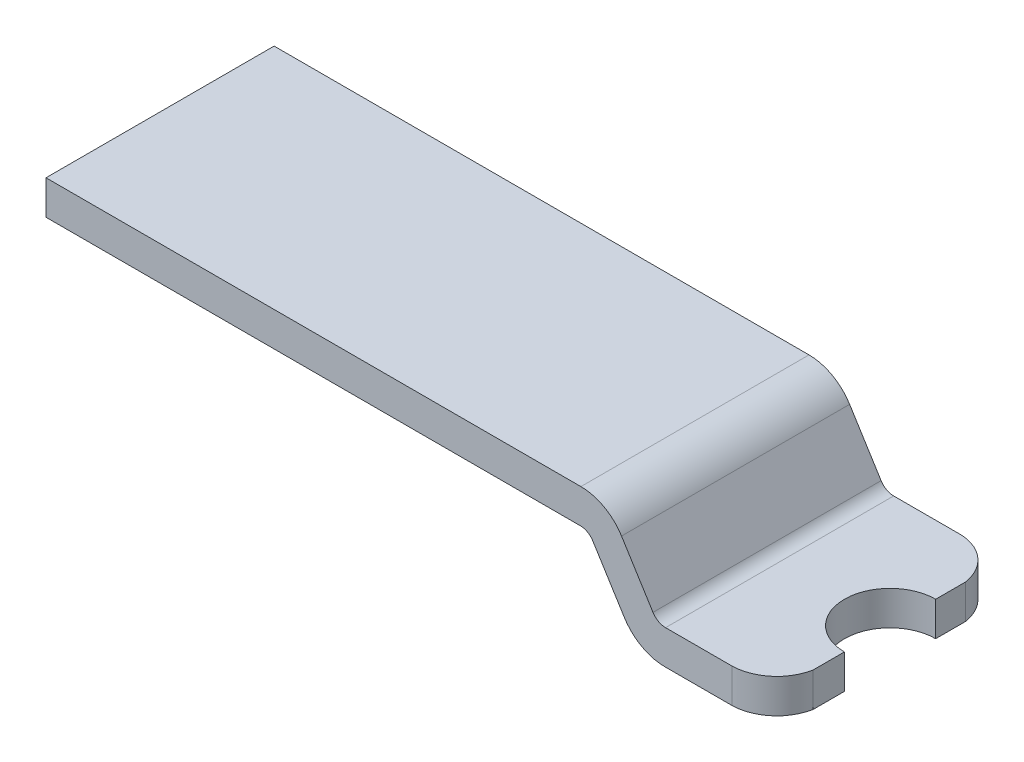
ISO-10303-21;
HEADER;
FILE_DESCRIPTION(('STEP AP214'),'2;1');
FILE_NAME('part.step','',(''),(''),'','','');
FILE_SCHEMA(('AUTOMOTIVE_DESIGN { 1 0 10303 214 1 1 1 1 }'));
ENDSEC;
DATA;
#1=APPLICATION_CONTEXT('core data for automotive mechanical design processes');
#2=APPLICATION_PROTOCOL_DEFINITION('international standard','automotive_design',2000,#1);
#3=PRODUCT_CONTEXT('',#1,'mechanical');
#4=PRODUCT('Part','Part','',(#3));
#5=PRODUCT_RELATED_PRODUCT_CATEGORY('part','',(#4));
#6=PRODUCT_DEFINITION_FORMATION('','',#4);
#7=PRODUCT_DEFINITION_CONTEXT('part definition',#1,'design');
#8=PRODUCT_DEFINITION('design','',#6,#7);
#9=PRODUCT_DEFINITION_SHAPE('','',#8);
#10=(LENGTH_UNIT() NAMED_UNIT(*) SI_UNIT(.MILLI.,.METRE.));
#11=(NAMED_UNIT(*) PLANE_ANGLE_UNIT() SI_UNIT($,.RADIAN.));
#12=(NAMED_UNIT(*) SI_UNIT($,.STERADIAN.) SOLID_ANGLE_UNIT());
#13=UNCERTAINTY_MEASURE_WITH_UNIT(LENGTH_MEASURE(1.E-05),#10,'distance_accuracy_value','');
#14=(GEOMETRIC_REPRESENTATION_CONTEXT(3) GLOBAL_UNCERTAINTY_ASSIGNED_CONTEXT((#13)) GLOBAL_UNIT_ASSIGNED_CONTEXT((#10,
#11,#12)) REPRESENTATION_CONTEXT('',''));
#15=CARTESIAN_POINT('',(0.,0.,0.));
#16=DIRECTION('',(0.,0.,1.));
#17=DIRECTION('',(1.,0.,0.));
#18=AXIS2_PLACEMENT_3D('',#15,#16,#17);
#19=CARTESIAN_POINT('',(2.3,0.,-8.));
#20=DIRECTION('',(0.,0.,1.));
#21=DIRECTION('',(1.,0.,0.));
#22=AXIS2_PLACEMENT_3D('',#19,#20,#21);
#23=PLANE('',#22);
#24=DIRECTION('',(-1.,0.,0.));
#25=VECTOR('',#24,1.);
#26=CARTESIAN_POINT('',(4.1,-0.1,-8.));
#27=LINE('',#26,#25);
#28=CARTESIAN_POINT('',(3.71335362730981,-0.1,-8.));
#29=VERTEX_POINT('',#28);
#30=CARTESIAN_POINT('',(3.12631708617434,-0.1,-8.));
#31=VERTEX_POINT('',#30);
#32=EDGE_CURVE('E40',#29,#31,#27,.T.);
#33=ORIENTED_EDGE('',*,*,#32,.F.);
#34=DIRECTION('',(0.,1.,0.));
#35=VECTOR('',#34,1.);
#36=CARTESIAN_POINT('',(3.7133536273113,-0.8,-8.));
#37=LINE('',#36,#35);
#38=CARTESIAN_POINT('',(3.7133536273113,0.2,-8.));
#39=VERTEX_POINT('',#38);
#40=EDGE_CURVE('E11',#29,#39,#37,.T.);
#41=ORIENTED_EDGE('',*,*,#40,.T.);
#42=DIRECTION('',(1.,0.,0.));
#43=VECTOR('',#42,1.);
#44=CARTESIAN_POINT('',(3.13186017668886,0.2,-8.));
#45=LINE('',#44,#43);
#46=CARTESIAN_POINT('',(3.13186017668886,0.2,-8.));
#47=VERTEX_POINT('',#46);
#48=EDGE_CURVE('E54',#47,#39,#45,.T.);
#49=ORIENTED_EDGE('',*,*,#48,.F.);
#50=CARTESIAN_POINT('',(3.13186017668886,0.33,-8.));
#51=DIRECTION('',(0.,0.,1.));
#52=DIRECTION('',(1.,0.,0.));
#53=AXIS2_PLACEMENT_3D('',#50,#51,#52);
#54=CIRCLE('',#53,0.13);
#55=CARTESIAN_POINT('',(3.02161392418853,0.261110495649684,-8.));
#56=VERTEX_POINT('',#55);
#57=EDGE_CURVE('E267',#56,#47,#54,.T.);
#58=ORIENTED_EDGE('',*,*,#57,.F.);
#59=DIRECTION('',(0.529919264233202,-0.848048096156428,0.));
#60=VECTOR('',#59,1.);
#61=CARTESIAN_POINT('',(2.74576185243899,0.702566090977968,-8.));
#62=LINE('',#61,#60);
#63=CARTESIAN_POINT('',(2.74576185243899,0.702566090977968,-8.));
#64=VERTEX_POINT('',#63);
#65=EDGE_CURVE('E229',#64,#56,#62,.T.);
#66=ORIENTED_EDGE('',*,*,#65,.F.);
#67=CARTESIAN_POINT('',(2.3895816520533,0.480000000000023,-8.));
#68=DIRECTION('',(0.,0.,-1.));
#69=DIRECTION('',(1.,0.,0.));
#70=AXIS2_PLACEMENT_3D('',#67,#68,#69);
#71=CIRCLE('',#70,0.42);
#72=CARTESIAN_POINT('',(2.3895816520533,0.900000000000023,-8.));
#73=VERTEX_POINT('',#72);
#74=EDGE_CURVE('E228',#73,#64,#71,.T.);
#75=ORIENTED_EDGE('',*,*,#74,.F.);
#76=DIRECTION('',(1.,0.,0.));
#77=VECTOR('',#76,1.);
#78=CARTESIAN_POINT('',(-2.3,0.900000000000023,-8.));
#79=LINE('',#78,#77);
#80=CARTESIAN_POINT('',(-2.3,0.900000000000023,-8.));
#81=VERTEX_POINT('',#80);
#82=EDGE_CURVE('E188',#81,#73,#79,.T.);
#83=ORIENTED_EDGE('',*,*,#82,.F.);
#84=DIRECTION('',(0.,1.,0.));
#85=VECTOR('',#84,1.);
#86=CARTESIAN_POINT('',(-2.3,0.900000000000023,-8.));
#87=LINE('',#86,#85);
#88=CARTESIAN_POINT('',(-2.3,0.600000000000024,-8.));
#89=VERTEX_POINT('',#88);
#90=EDGE_CURVE('E183',#89,#81,#87,.T.);
#91=ORIENTED_EDGE('',*,*,#90,.F.);
#92=DIRECTION('',(-1.,0.,0.));
#93=VECTOR('',#92,1.);
#94=CARTESIAN_POINT('',(-2.3,0.600000000000024,-8.));
#95=LINE('',#94,#93);
#96=CARTESIAN_POINT('',(2.38403856153877,0.600000000000023,-8.));
#97=VERTEX_POINT('',#96);
#98=EDGE_CURVE('E185',#97,#89,#95,.T.);
#99=ORIENTED_EDGE('',*,*,#98,.F.);
#100=CARTESIAN_POINT('',(2.38403856153877,0.470000000000023,-8.));
#101=DIRECTION('',(0.,0.,1.));
#102=DIRECTION('',(1.,0.,0.));
#103=AXIS2_PLACEMENT_3D('',#100,#101,#102);
#104=CIRCLE('',#103,0.13);
#105=CARTESIAN_POINT('',(2.4942848140391,0.538889504350339,-8.));
#106=VERTEX_POINT('',#105);
#107=EDGE_CURVE('E317',#106,#97,#104,.T.);
#108=ORIENTED_EDGE('',*,*,#107,.F.);
#109=DIRECTION('',(-0.529919264233202,0.848048096156428,0.));
#110=VECTOR('',#109,1.);
#111=CARTESIAN_POINT('',(2.77013688578863,0.0974339090220547,-8.));
#112=LINE('',#111,#110);
#113=CARTESIAN_POINT('',(2.77013688578863,0.0974339090220546,-8.));
#114=VERTEX_POINT('',#113);
#115=EDGE_CURVE('E257',#114,#106,#112,.T.);
#116=ORIENTED_EDGE('',*,*,#115,.F.);
#117=CARTESIAN_POINT('',(3.12631708617434,0.32,-8.));
#118=DIRECTION('',(0.,0.,-1.));
#119=DIRECTION('',(1.,0.,0.));
#120=AXIS2_PLACEMENT_3D('',#117,#118,#119);
#121=CIRCLE('',#120,0.42);
#122=EDGE_CURVE('E268',#31,#114,#121,.T.);
#123=ORIENTED_EDGE('',*,*,#122,.F.);
#124=EDGE_LOOP('',(#33,#41,#49,#58,#66,#75,#83,#91,#99,#108,#116,#123));
#125=FACE_BOUND('',#124,.T.);
#126=ADVANCED_FACE('F17',(#125),#23,.T.);
#127=CARTESIAN_POINT('',(2.38403856153877,0.470000000000023,-10.));
#128=DIRECTION('',(0.,0.,-1.));
#129=DIRECTION('',(0.,-1.,0.));
#130=AXIS2_PLACEMENT_3D('',#127,#128,#129);
#131=PLANE('',#130);
#132=DIRECTION('',(1.,0.,0.));
#133=VECTOR('',#132,1.);
#134=CARTESIAN_POINT('',(3.13186017668886,0.2,-10.));
#135=LINE('',#134,#133);
#136=CARTESIAN_POINT('',(3.13186017668886,0.2,-10.));
#137=VERTEX_POINT('',#136);
#138=CARTESIAN_POINT('',(3.72808084210081,0.2,-10.));
#139=VERTEX_POINT('',#138);
#140=EDGE_CURVE('E27',#137,#139,#135,.T.);
#141=ORIENTED_EDGE('',*,*,#140,.T.);
#142=DIRECTION('',(0.,1.,0.));
#143=VECTOR('',#142,1.);
#144=CARTESIAN_POINT('',(3.72808084210081,-0.8,-10.));
#145=LINE('',#144,#143);
#146=CARTESIAN_POINT('',(3.72808084210081,-0.1,-10.));
#147=VERTEX_POINT('',#146);
#148=EDGE_CURVE('E216',#147,#139,#145,.T.);
#149=ORIENTED_EDGE('',*,*,#148,.F.);
#150=DIRECTION('',(-1.,0.,0.));
#151=VECTOR('',#150,1.);
#152=CARTESIAN_POINT('',(4.1,-0.1,-10.));
#153=LINE('',#152,#151);
#154=CARTESIAN_POINT('',(3.12631708617434,-0.1,-10.));
#155=VERTEX_POINT('',#154);
#156=EDGE_CURVE('E331',#147,#155,#153,.T.);
#157=ORIENTED_EDGE('',*,*,#156,.T.);
#158=CARTESIAN_POINT('',(3.12631708617434,0.32,-10.));
#159=DIRECTION('',(0.,0.,-1.));
#160=DIRECTION('',(-1.,0.,0.));
#161=AXIS2_PLACEMENT_3D('',#158,#159,#160);
#162=CIRCLE('',#161,0.42);
#163=CARTESIAN_POINT('',(2.77013688578863,0.0974339090220547,-10.));
#164=VERTEX_POINT('',#163);
#165=EDGE_CURVE('E273',#155,#164,#162,.T.);
#166=ORIENTED_EDGE('',*,*,#165,.T.);
#167=DIRECTION('',(-0.529919264233202,0.848048096156428,0.));
#168=VECTOR('',#167,1.);
#169=CARTESIAN_POINT('',(2.77013688578863,0.0974339090220547,-10.));
#170=LINE('',#169,#168);
#171=CARTESIAN_POINT('',(2.4942848140391,0.538889504350339,-10.));
#172=VERTEX_POINT('',#171);
#173=EDGE_CURVE('E269',#164,#172,#170,.T.);
#174=ORIENTED_EDGE('',*,*,#173,.T.);
#175=CARTESIAN_POINT('',(2.38403856153877,0.470000000000023,-10.));
#176=DIRECTION('',(0.,0.,1.));
#177=DIRECTION('',(-1.,0.,0.));
#178=AXIS2_PLACEMENT_3D('',#175,#176,#177);
#179=CIRCLE('',#178,0.13);
#180=CARTESIAN_POINT('',(2.38403856153877,0.600000000000023,-10.));
#181=VERTEX_POINT('',#180);
#182=EDGE_CURVE('E274',#172,#181,#179,.T.);
#183=ORIENTED_EDGE('',*,*,#182,.T.);
#184=DIRECTION('',(-1.,0.,0.));
#185=VECTOR('',#184,1.);
#186=CARTESIAN_POINT('',(-2.3,0.600000000000024,-10.));
#187=LINE('',#186,#185);
#188=CARTESIAN_POINT('',(-2.3,0.600000000000024,-10.));
#189=VERTEX_POINT('',#188);
#190=EDGE_CURVE('E371',#181,#189,#187,.T.);
#191=ORIENTED_EDGE('',*,*,#190,.T.);
#192=DIRECTION('',(0.,1.,0.));
#193=VECTOR('',#192,1.);
#194=CARTESIAN_POINT('',(-2.3,0.900000000000023,-10.));
#195=LINE('',#194,#193);
#196=CARTESIAN_POINT('',(-2.3,0.900000000000023,-10.));
#197=VERTEX_POINT('',#196);
#198=EDGE_CURVE('E21',#189,#197,#195,.T.);
#199=ORIENTED_EDGE('',*,*,#198,.T.);
#200=DIRECTION('',(1.,0.,0.));
#201=VECTOR('',#200,1.);
#202=CARTESIAN_POINT('',(-2.3,0.900000000000023,-10.));
#203=LINE('',#202,#201);
#204=CARTESIAN_POINT('',(2.3895816520533,0.900000000000023,-10.));
#205=VERTEX_POINT('',#204);
#206=EDGE_CURVE('E313',#197,#205,#203,.T.);
#207=ORIENTED_EDGE('',*,*,#206,.T.);
#208=CARTESIAN_POINT('',(2.3895816520533,0.480000000000023,-10.));
#209=DIRECTION('',(0.,0.,-1.));
#210=DIRECTION('',(-1.,0.,0.));
#211=AXIS2_PLACEMENT_3D('',#208,#209,#210);
#212=CIRCLE('',#211,0.42);
#213=CARTESIAN_POINT('',(2.74576185243899,0.702566090977968,-10.));
#214=VERTEX_POINT('',#213);
#215=EDGE_CURVE('E360',#205,#214,#212,.T.);
#216=ORIENTED_EDGE('',*,*,#215,.T.);
#217=DIRECTION('',(0.529919264233202,-0.848048096156428,0.));
#218=VECTOR('',#217,1.);
#219=CARTESIAN_POINT('',(2.74576185243899,0.702566090977968,-10.));
#220=LINE('',#219,#218);
#221=CARTESIAN_POINT('',(3.02161392418853,0.261110495649684,-10.));
#222=VERTEX_POINT('',#221);
#223=EDGE_CURVE('E321',#214,#222,#220,.T.);
#224=ORIENTED_EDGE('',*,*,#223,.T.);
#225=CARTESIAN_POINT('',(3.13186017668886,0.33,-10.));
#226=DIRECTION('',(0.,0.,1.));
#227=DIRECTION('',(1.,0.,0.));
#228=AXIS2_PLACEMENT_3D('',#225,#226,#227);
#229=CIRCLE('',#228,0.13);
#230=EDGE_CURVE('E318',#222,#137,#229,.T.);
#231=ORIENTED_EDGE('',*,*,#230,.T.);
#232=EDGE_LOOP('',(#141,#149,#157,#166,#174,#183,#191,#199,#207,#216,#224,#231));
#233=FACE_BOUND('',#232,.T.);
#234=ADVANCED_FACE('F366',(#233),#131,.T.);
#235=CARTESIAN_POINT('',(3.13186017668886,0.2,-1.52234610371931));
#236=DIRECTION('',(0.,1.,0.));
#237=DIRECTION('',(1.,0.,0.));
#238=AXIS2_PLACEMENT_3D('',#235,#236,#237);
#239=PLANE('',#238);
#240=DIRECTION('',(0.,0.,-1.));
#241=VECTOR('',#240,1.);
#242=CARTESIAN_POINT('',(4.1,0.2,-1.52234610371931));
#243=LINE('',#242,#241);
#244=CARTESIAN_POINT('',(4.1,0.2,-9.4));
#245=VERTEX_POINT('',#244);
#246=CARTESIAN_POINT('',(4.1,0.2,-9.66238740850072));
#247=VERTEX_POINT('',#246);
#248=EDGE_CURVE('E322',#245,#247,#243,.T.);
#249=ORIENTED_EDGE('',*,*,#248,.T.);
#250=CARTESIAN_POINT('',(3.70478861389911,0.2,-9.60067873572101));
#251=DIRECTION('',(0.,1.,0.));
#252=DIRECTION('',(-1.,0.,0.));
#253=AXIS2_PLACEMENT_3D('',#250,#251,#252);
#254=CIRCLE('',#253,0.399999999999989);
#255=EDGE_CURVE('E335',#247,#139,#254,.T.);
#256=ORIENTED_EDGE('',*,*,#255,.T.);
#257=ORIENTED_EDGE('',*,*,#140,.F.);
#258=DIRECTION('',(0.,0.,-1.));
#259=VECTOR('',#258,1.);
#260=CARTESIAN_POINT('',(3.13186017668886,0.2,-1.52234610371931));
#261=LINE('',#260,#259);
#262=EDGE_CURVE('E263',#47,#137,#261,.T.);
#263=ORIENTED_EDGE('',*,*,#262,.F.);
#264=ORIENTED_EDGE('',*,*,#48,.T.);
#265=CARTESIAN_POINT('',(3.70683202464768,0.2,-8.39994683233988));
#266=DIRECTION('',(0.,1.,0.));
#267=DIRECTION('',(-1.,0.,0.));
#268=AXIS2_PLACEMENT_3D('',#265,#266,#267);
#269=CIRCLE('',#268,0.4);
#270=CARTESIAN_POINT('',(4.1,0.2,-8.32633336103622));
#271=VERTEX_POINT('',#270);
#272=EDGE_CURVE('E383',#39,#271,#269,.T.);
#273=ORIENTED_EDGE('',*,*,#272,.T.);
#274=DIRECTION('',(0.,0.,-1.));
#275=VECTOR('',#274,1.);
#276=CARTESIAN_POINT('',(4.1,0.2,-1.52234610371931));
#277=LINE('',#276,#275);
#278=CARTESIAN_POINT('',(4.1,0.2,-8.6));
#279=VERTEX_POINT('',#278);
#280=EDGE_CURVE('E281',#271,#279,#277,.T.);
#281=ORIENTED_EDGE('',*,*,#280,.T.);
#282=CARTESIAN_POINT('',(4.1,0.2,-9.));
#283=DIRECTION('',(0.,1.,0.));
#284=DIRECTION('',(-1.,0.,0.));
#285=AXIS2_PLACEMENT_3D('',#282,#283,#284);
#286=CIRCLE('',#285,0.4);
#287=EDGE_CURVE('E233',#245,#279,#286,.T.);
#288=ORIENTED_EDGE('',*,*,#287,.F.);
#289=EDGE_LOOP('',(#249,#256,#257,#263,#264,#273,#281,#288));
#290=FACE_BOUND('',#289,.T.);
#291=ADVANCED_FACE('F629',(#290),#239,.T.);
#292=CARTESIAN_POINT('',(4.1,0.2,-1.52234610371931));
#293=DIRECTION('',(1.,0.,0.));
#294=DIRECTION('',(0.,1.,0.));
#295=AXIS2_PLACEMENT_3D('',#292,#293,#294);
#296=PLANE('',#295);
#297=DIRECTION('',(0.,0.,-1.));
#298=VECTOR('',#297,1.);
#299=CARTESIAN_POINT('',(4.1,-0.1,-1.52234610371931));
#300=LINE('',#299,#298);
#301=CARTESIAN_POINT('',(4.1,-0.1,-9.4));
#302=VERTEX_POINT('',#301);
#303=CARTESIAN_POINT('',(4.1,-0.1,-9.66238740850072));
#304=VERTEX_POINT('',#303);
#305=EDGE_CURVE('E278',#302,#304,#300,.T.);
#306=ORIENTED_EDGE('',*,*,#305,.T.);
#307=DIRECTION('',(0.,1.,0.));
#308=VECTOR('',#307,1.);
#309=CARTESIAN_POINT('',(4.1,-0.8,-9.66238740850072));
#310=LINE('',#309,#308);
#311=EDGE_CURVE('E90',#304,#247,#310,.T.);
#312=ORIENTED_EDGE('',*,*,#311,.T.);
#313=ORIENTED_EDGE('',*,*,#248,.F.);
#314=DIRECTION('',(0.,1.,0.));
#315=VECTOR('',#314,1.);
#316=CARTESIAN_POINT('',(4.1,-0.8,-9.4));
#317=LINE('',#316,#315);
#318=EDGE_CURVE('E106',#302,#245,#317,.T.);
#319=ORIENTED_EDGE('',*,*,#318,.F.);
#320=EDGE_LOOP('',(#306,#312,#313,#319));
#321=FACE_BOUND('',#320,.T.);
#322=ADVANCED_FACE('F623',(#321),#296,.T.);
#323=CARTESIAN_POINT('',(4.1,0.2,-1.52234610371931));
#324=DIRECTION('',(1.,0.,0.));
#325=DIRECTION('',(0.,1.,0.));
#326=AXIS2_PLACEMENT_3D('',#323,#324,#325);
#327=PLANE('',#326);
#328=ORIENTED_EDGE('',*,*,#280,.F.);
#329=DIRECTION('',(0.,1.,0.));
#330=VECTOR('',#329,1.);
#331=CARTESIAN_POINT('',(4.1,-0.8,-8.32633336103622));
#332=LINE('',#331,#330);
#333=CARTESIAN_POINT('',(4.1,-0.1,-8.32633336103622));
#334=VERTEX_POINT('',#333);
#335=EDGE_CURVE('E219',#334,#271,#332,.T.);
#336=ORIENTED_EDGE('',*,*,#335,.F.);
#337=DIRECTION('',(0.,0.,-1.));
#338=VECTOR('',#337,1.);
#339=CARTESIAN_POINT('',(4.1,-0.1,-1.52234610371931));
#340=LINE('',#339,#338);
#341=CARTESIAN_POINT('',(4.1,-0.1,-8.6));
#342=VERTEX_POINT('',#341);
#343=EDGE_CURVE('E220',#334,#342,#340,.T.);
#344=ORIENTED_EDGE('',*,*,#343,.T.);
#345=DIRECTION('',(0.,1.,0.));
#346=VECTOR('',#345,1.);
#347=CARTESIAN_POINT('',(4.1,-0.8,-8.6));
#348=LINE('',#347,#346);
#349=EDGE_CURVE('E224',#342,#279,#348,.T.);
#350=ORIENTED_EDGE('',*,*,#349,.T.);
#351=EDGE_LOOP('',(#328,#336,#344,#350));
#352=FACE_BOUND('',#351,.T.);
#353=ADVANCED_FACE('F628',(#352),#327,.T.);
#354=CARTESIAN_POINT('',(4.1,-0.1,-1.52234610371931));
#355=DIRECTION('',(0.,-1.,0.));
#356=DIRECTION('',(0.,0.,-1.));
#357=AXIS2_PLACEMENT_3D('',#354,#355,#356);
#358=PLANE('',#357);
#359=ORIENTED_EDGE('',*,*,#156,.F.);
#360=CARTESIAN_POINT('',(3.70478861389911,-0.1,-9.60067873572101));
#361=DIRECTION('',(0.,-1.,0.));
#362=DIRECTION('',(0.,0.,-1.));
#363=AXIS2_PLACEMENT_3D('',#360,#361,#362);
#364=CIRCLE('',#363,0.399999999999989);
#365=EDGE_CURVE('E282',#147,#304,#364,.T.);
#366=ORIENTED_EDGE('',*,*,#365,.T.);
#367=ORIENTED_EDGE('',*,*,#305,.F.);
#368=CARTESIAN_POINT('',(4.1,-0.1,-9.));
#369=DIRECTION('',(0.,-1.,0.));
#370=DIRECTION('',(0.,0.,-1.));
#371=AXIS2_PLACEMENT_3D('',#368,#369,#370);
#372=CIRCLE('',#371,0.4);
#373=EDGE_CURVE('E230',#342,#302,#372,.T.);
#374=ORIENTED_EDGE('',*,*,#373,.F.);
#375=ORIENTED_EDGE('',*,*,#343,.F.);
#376=CARTESIAN_POINT('',(3.70683202464768,-0.1,-8.39994683233988));
#377=DIRECTION('',(0.,-1.,0.));
#378=DIRECTION('',(0.,0.,-1.));
#379=AXIS2_PLACEMENT_3D('',#376,#377,#378);
#380=CIRCLE('',#379,0.400000000000005);
#381=EDGE_CURVE('E286',#334,#29,#380,.T.);
#382=ORIENTED_EDGE('',*,*,#381,.T.);
#383=ORIENTED_EDGE('',*,*,#32,.T.);
#384=DIRECTION('',(0.,0.,-1.));
#385=VECTOR('',#384,1.);
#386=CARTESIAN_POINT('',(3.12631708617434,-0.1,-1.52234610371931));
#387=LINE('',#386,#385);
#388=EDGE_CURVE('E287',#31,#155,#387,.T.);
#389=ORIENTED_EDGE('',*,*,#388,.T.);
#390=EDGE_LOOP('',(#359,#366,#367,#374,#375,#382,#383,#389));
#391=FACE_BOUND('',#390,.T.);
#392=ADVANCED_FACE('F19',(#391),#358,.T.);
#393=CARTESIAN_POINT('',(-2.3,0.900000000000023,-1.52234610371931));
#394=DIRECTION('',(0.,1.,0.));
#395=DIRECTION('',(1.,0.,0.));
#396=AXIS2_PLACEMENT_3D('',#393,#394,#395);
#397=PLANE('',#396);
#398=DIRECTION('',(0.,0.,-1.));
#399=VECTOR('',#398,1.);
#400=CARTESIAN_POINT('',(-2.3,0.900000000000023,-1.52234610371931));
#401=LINE('',#400,#399);
#402=EDGE_CURVE('E195',#81,#197,#401,.T.);
#403=ORIENTED_EDGE('',*,*,#402,.F.);
#404=ORIENTED_EDGE('',*,*,#82,.T.);
#405=DIRECTION('',(0.,0.,-1.));
#406=VECTOR('',#405,1.);
#407=CARTESIAN_POINT('',(2.3895816520533,0.900000000000023,-1.52234610371931));
#408=LINE('',#407,#406);
#409=EDGE_CURVE('E256',#73,#205,#408,.T.);
#410=ORIENTED_EDGE('',*,*,#409,.T.);
#411=ORIENTED_EDGE('',*,*,#206,.F.);
#412=EDGE_LOOP('',(#403,#404,#410,#411));
#413=FACE_BOUND('',#412,.T.);
#414=ADVANCED_FACE('F355',(#413),#397,.T.);
#415=CARTESIAN_POINT('',(2.3895816520533,0.480000000000023,-1.52234610371931));
#416=DIRECTION('',(0.,0.,-1.));
#417=DIRECTION('',(-1.,0.,0.));
#418=AXIS2_PLACEMENT_3D('',#415,#416,#417);
#419=CYLINDRICAL_SURFACE('',#418,0.42);
#420=ORIENTED_EDGE('',*,*,#409,.F.);
#421=ORIENTED_EDGE('',*,*,#74,.T.);
#422=DIRECTION('',(0.,0.,-1.));
#423=VECTOR('',#422,1.);
#424=CARTESIAN_POINT('',(2.74576185243899,0.702566090977968,-1.52234610371931));
#425=LINE('',#424,#423);
#426=EDGE_CURVE('E225',#64,#214,#425,.T.);
#427=ORIENTED_EDGE('',*,*,#426,.T.);
#428=ORIENTED_EDGE('',*,*,#215,.F.);
#429=EDGE_LOOP('',(#420,#421,#427,#428));
#430=FACE_BOUND('',#429,.T.);
#431=ADVANCED_FACE('F358',(#430),#419,.T.);
#432=CARTESIAN_POINT('',(2.74576185243899,0.702566090977968,-1.52234610371931));
#433=DIRECTION('',(0.848048096156428,0.529919264233202,0.));
#434=DIRECTION('',(0.,0.,-1.));
#435=AXIS2_PLACEMENT_3D('',#432,#433,#434);
#436=PLANE('',#435);
#437=ORIENTED_EDGE('',*,*,#426,.F.);
#438=ORIENTED_EDGE('',*,*,#65,.T.);
#439=DIRECTION('',(0.,0.,-1.));
#440=VECTOR('',#439,1.);
#441=CARTESIAN_POINT('',(3.02161392418853,0.261110495649684,-1.52234610371931));
#442=LINE('',#441,#440);
#443=EDGE_CURVE('E296',#56,#222,#442,.T.);
#444=ORIENTED_EDGE('',*,*,#443,.T.);
#445=ORIENTED_EDGE('',*,*,#223,.F.);
#446=EDGE_LOOP('',(#437,#438,#444,#445));
#447=FACE_BOUND('',#446,.T.);
#448=ADVANCED_FACE('F607',(#447),#436,.T.);
#449=CARTESIAN_POINT('',(3.13186017668886,0.33,-1.52234610371931));
#450=DIRECTION('',(0.,0.,-1.));
#451=DIRECTION('',(-1.,0.,0.));
#452=AXIS2_PLACEMENT_3D('',#449,#450,#451);
#453=CYLINDRICAL_SURFACE('',#452,0.13);
#454=ORIENTED_EDGE('',*,*,#443,.F.);
#455=ORIENTED_EDGE('',*,*,#57,.T.);
#456=ORIENTED_EDGE('',*,*,#262,.T.);
#457=ORIENTED_EDGE('',*,*,#230,.F.);
#458=EDGE_LOOP('',(#454,#455,#456,#457));
#459=FACE_BOUND('',#458,.T.);
#460=ADVANCED_FACE('F612',(#459),#453,.F.);
#461=CARTESIAN_POINT('',(3.12631708617434,0.32,-1.52234610371931));
#462=DIRECTION('',(0.,0.,-1.));
#463=DIRECTION('',(-1.,0.,0.));
#464=AXIS2_PLACEMENT_3D('',#461,#462,#463);
#465=CYLINDRICAL_SURFACE('',#464,0.42);
#466=ORIENTED_EDGE('',*,*,#388,.F.);
#467=ORIENTED_EDGE('',*,*,#122,.T.);
#468=DIRECTION('',(0.,0.,-1.));
#469=VECTOR('',#468,1.);
#470=CARTESIAN_POINT('',(2.77013688578863,0.0974339090220547,-1.52234610371931));
#471=LINE('',#470,#469);
#472=EDGE_CURVE('E261',#114,#164,#471,.T.);
#473=ORIENTED_EDGE('',*,*,#472,.T.);
#474=ORIENTED_EDGE('',*,*,#165,.F.);
#475=EDGE_LOOP('',(#466,#467,#473,#474));
#476=FACE_BOUND('',#475,.T.);
#477=ADVANCED_FACE('F672',(#476),#465,.T.);
#478=CARTESIAN_POINT('',(2.77013688578863,0.0974339090220547,-1.52234610371931));
#479=DIRECTION('',(-0.848048096156428,-0.529919264233202,0.));
#480=DIRECTION('',(-0.529919264233202,0.848048096156428,0.));
#481=AXIS2_PLACEMENT_3D('',#478,#479,#480);
#482=PLANE('',#481);
#483=ORIENTED_EDGE('',*,*,#472,.F.);
#484=ORIENTED_EDGE('',*,*,#115,.T.);
#485=DIRECTION('',(0.,0.,-1.));
#486=VECTOR('',#485,1.);
#487=CARTESIAN_POINT('',(2.4942848140391,0.538889504350339,-1.52234610371931));
#488=LINE('',#487,#486);
#489=EDGE_CURVE('E262',#106,#172,#488,.T.);
#490=ORIENTED_EDGE('',*,*,#489,.T.);
#491=ORIENTED_EDGE('',*,*,#173,.F.);
#492=EDGE_LOOP('',(#483,#484,#490,#491));
#493=FACE_BOUND('',#492,.T.);
#494=ADVANCED_FACE('F666',(#493),#482,.T.);
#495=CARTESIAN_POINT('',(2.38403856153877,0.470000000000023,-1.52234610371931));
#496=DIRECTION('',(0.,0.,-1.));
#497=DIRECTION('',(-1.,0.,0.));
#498=AXIS2_PLACEMENT_3D('',#495,#496,#497);
#499=CYLINDRICAL_SURFACE('',#498,0.13);
#500=ORIENTED_EDGE('',*,*,#489,.F.);
#501=ORIENTED_EDGE('',*,*,#107,.T.);
#502=DIRECTION('',(0.,0.,-1.));
#503=VECTOR('',#502,1.);
#504=CARTESIAN_POINT('',(2.38403856153877,0.600000000000023,-1.52234610371931));
#505=LINE('',#504,#503);
#506=EDGE_CURVE('E202',#97,#181,#505,.T.);
#507=ORIENTED_EDGE('',*,*,#506,.T.);
#508=ORIENTED_EDGE('',*,*,#182,.F.);
#509=EDGE_LOOP('',(#500,#501,#507,#508));
#510=FACE_BOUND('',#509,.T.);
#511=ADVANCED_FACE('F671',(#510),#499,.F.);
#512=CARTESIAN_POINT('',(-2.3,0.600000000000024,-1.52234610371931));
#513=DIRECTION('',(0.,-1.,0.));
#514=DIRECTION('',(-1.,0.,0.));
#515=AXIS2_PLACEMENT_3D('',#512,#513,#514);
#516=PLANE('',#515);
#517=ORIENTED_EDGE('',*,*,#506,.F.);
#518=ORIENTED_EDGE('',*,*,#98,.T.);
#519=DIRECTION('',(0.,0.,-1.));
#520=VECTOR('',#519,1.);
#521=CARTESIAN_POINT('',(-2.3,0.600000000000024,-1.52234610371931));
#522=LINE('',#521,#520);
#523=EDGE_CURVE('E194',#89,#189,#522,.T.);
#524=ORIENTED_EDGE('',*,*,#523,.T.);
#525=ORIENTED_EDGE('',*,*,#190,.F.);
#526=EDGE_LOOP('',(#517,#518,#524,#525));
#527=FACE_BOUND('',#526,.T.);
#528=ADVANCED_FACE('F200',(#527),#516,.T.);
#529=CARTESIAN_POINT('',(-2.3,0.900000000000023,-1.52234610371931));
#530=DIRECTION('',(-1.,0.,0.));
#531=DIRECTION('',(0.,0.,1.));
#532=AXIS2_PLACEMENT_3D('',#529,#530,#531);
#533=PLANE('',#532);
#534=ORIENTED_EDGE('',*,*,#523,.F.);
#535=ORIENTED_EDGE('',*,*,#90,.T.);
#536=ORIENTED_EDGE('',*,*,#402,.T.);
#537=ORIENTED_EDGE('',*,*,#198,.F.);
#538=EDGE_LOOP('',(#534,#535,#536,#537));
#539=FACE_BOUND('',#538,.T.);
#540=ADVANCED_FACE('F205',(#539),#533,.T.);
#541=CARTESIAN_POINT('',(4.1,-0.8,-9.));
#542=DIRECTION('',(0.,1.,0.));
#543=DIRECTION('',(0.,0.,1.));
#544=AXIS2_PLACEMENT_3D('',#541,#542,#543);
#545=CYLINDRICAL_SURFACE('',#544,0.4);
#546=ORIENTED_EDGE('',*,*,#287,.T.);
#547=ORIENTED_EDGE('',*,*,#349,.F.);
#548=ORIENTED_EDGE('',*,*,#373,.T.);
#549=ORIENTED_EDGE('',*,*,#318,.T.);
#550=EDGE_LOOP('',(#546,#547,#548,#549));
#551=FACE_BOUND('',#550,.T.);
#552=ADVANCED_FACE('F651',(#551),#545,.F.);
#553=CARTESIAN_POINT('',(3.70683202464768,-0.8,-8.39994683233988));
#554=DIRECTION('',(0.,1.,0.));
#555=DIRECTION('',(0.,0.,1.));
#556=AXIS2_PLACEMENT_3D('',#553,#554,#555);
#557=CYLINDRICAL_SURFACE('',#556,0.400000000000005);
#558=ORIENTED_EDGE('',*,*,#40,.F.);
#559=ORIENTED_EDGE('',*,*,#381,.F.);
#560=ORIENTED_EDGE('',*,*,#335,.T.);
#561=ORIENTED_EDGE('',*,*,#272,.F.);
#562=EDGE_LOOP('',(#558,#559,#560,#561));
#563=FACE_BOUND('',#562,.T.);
#564=ADVANCED_FACE('F656',(#563),#557,.T.);
#565=CARTESIAN_POINT('',(3.70478861389911,-0.8,-9.60067873572101));
#566=DIRECTION('',(0.,1.,0.));
#567=DIRECTION('',(0.,0.,1.));
#568=AXIS2_PLACEMENT_3D('',#565,#566,#567);
#569=CYLINDRICAL_SURFACE('',#568,0.399999999999989);
#570=ORIENTED_EDGE('',*,*,#311,.F.);
#571=ORIENTED_EDGE('',*,*,#365,.F.);
#572=ORIENTED_EDGE('',*,*,#148,.T.);
#573=ORIENTED_EDGE('',*,*,#255,.F.);
#574=EDGE_LOOP('',(#570,#571,#572,#573));
#575=FACE_BOUND('',#574,.T.);
#576=ADVANCED_FACE('F708',(#575),#569,.T.);
#577=CLOSED_SHELL('',(#126,#234,#291,#322,#353,#392,#414,#431,#448,#460,#477,#494,#511,#528,
#540,#552,#564,#576));
#578=MANIFOLD_SOLID_BREP('B1',#577);
#579=ADVANCED_BREP_SHAPE_REPRESENTATION('',(#18,#578),#14);
#580=SHAPE_DEFINITION_REPRESENTATION(#9,#579);
ENDSEC;
END-ISO-10303-21;
